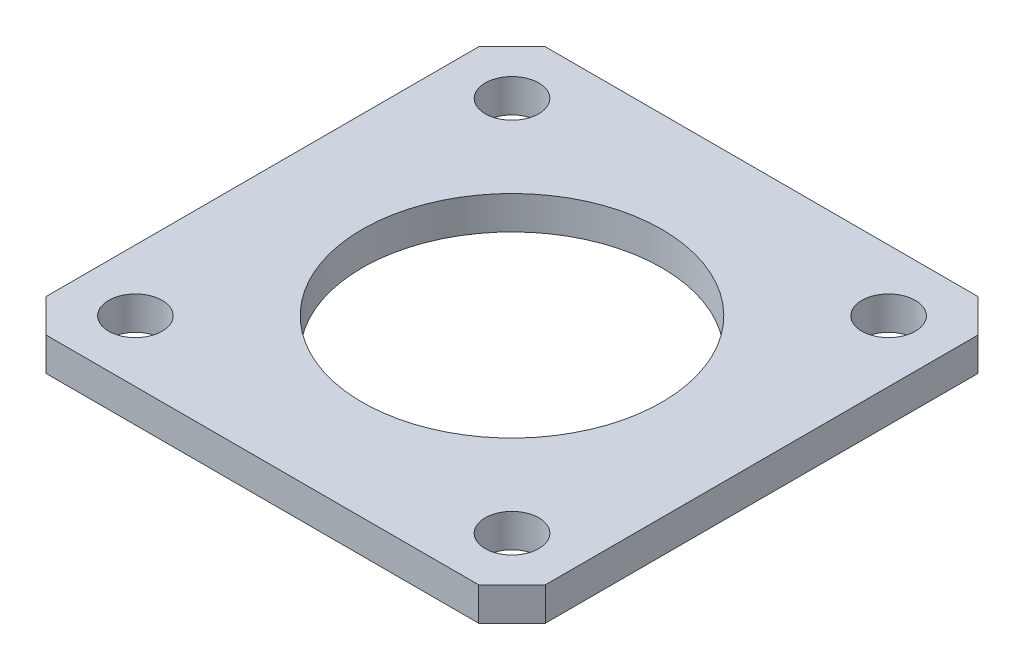
ISO-10303-21;
HEADER;
FILE_DESCRIPTION(('STEP AP214'),'2;1');
FILE_NAME('part.step','',(''),(''),'','','');
FILE_SCHEMA(('AUTOMOTIVE_DESIGN { 1 0 10303 214 1 1 1 1 }'));
ENDSEC;
DATA;
#1=APPLICATION_CONTEXT('core data for automotive mechanical design processes');
#2=APPLICATION_PROTOCOL_DEFINITION('international standard','automotive_design',2000,#1);
#3=PRODUCT_CONTEXT('',#1,'mechanical');
#4=PRODUCT('Part','Part','',(#3));
#5=PRODUCT_RELATED_PRODUCT_CATEGORY('part','',(#4));
#6=PRODUCT_DEFINITION_FORMATION('','',#4);
#7=PRODUCT_DEFINITION_CONTEXT('part definition',#1,'design');
#8=PRODUCT_DEFINITION('design','',#6,#7);
#9=PRODUCT_DEFINITION_SHAPE('','',#8);
#10=(LENGTH_UNIT() NAMED_UNIT(*) SI_UNIT(.MILLI.,.METRE.));
#11=(NAMED_UNIT(*) PLANE_ANGLE_UNIT() SI_UNIT($,.RADIAN.));
#12=(NAMED_UNIT(*) SI_UNIT($,.STERADIAN.) SOLID_ANGLE_UNIT());
#13=UNCERTAINTY_MEASURE_WITH_UNIT(LENGTH_MEASURE(1.E-05),#10,'distance_accuracy_value','');
#14=(GEOMETRIC_REPRESENTATION_CONTEXT(3) GLOBAL_UNCERTAINTY_ASSIGNED_CONTEXT((#13)) GLOBAL_UNIT_ASSIGNED_CONTEXT((#10,
#11,#12)) REPRESENTATION_CONTEXT('',''));
#15=CARTESIAN_POINT('',(0.,0.,0.));
#16=DIRECTION('',(0.,0.,1.));
#17=DIRECTION('',(1.,0.,0.));
#18=AXIS2_PLACEMENT_3D('',#15,#16,#17);
#19=CARTESIAN_POINT('',(0.,3.175,0.));
#20=DIRECTION('',(0.,-1.,0.));
#21=DIRECTION('',(0.,0.,-1.));
#22=AXIS2_PLACEMENT_3D('',#19,#20,#21);
#23=PLANE('',#22);
#24=CARTESIAN_POINT('',(5.85198775786169,3.175,-5.85198775786169));
#25=DIRECTION('',(0.,-1.,0.));
#26=DIRECTION('',(0.,0.,-1.));
#27=AXIS2_PLACEMENT_3D('',#24,#25,#26);
#28=CIRCLE('',#27,2.5527);
#29=CARTESIAN_POINT('',(5.85198775786169,3.175,-8.4046877578617));
#30=VERTEX_POINT('',#29);
#31=EDGE_CURVE('E126',#30,#30,#28,.T.);
#32=ORIENTED_EDGE('',*,*,#31,.T.);
#33=EDGE_LOOP('',(#32));
#34=FACE_BOUND('',#33,.T.);
#35=CARTESIAN_POINT('',(41.7730122421383,3.175,-5.85198775786169));
#36=DIRECTION('',(0.,-1.,0.));
#37=DIRECTION('',(0.,0.,-1.));
#38=AXIS2_PLACEMENT_3D('',#35,#36,#37);
#39=CIRCLE('',#38,2.5527);
#40=CARTESIAN_POINT('',(41.7730122421383,3.175,-8.40468775786169));
#41=VERTEX_POINT('',#40);
#42=EDGE_CURVE('E146',#41,#41,#39,.T.);
#43=ORIENTED_EDGE('',*,*,#42,.T.);
#44=EDGE_LOOP('',(#43));
#45=FACE_BOUND('',#44,.T.);
#46=CARTESIAN_POINT('',(41.7730122421383,3.175,-41.7730122421383));
#47=DIRECTION('',(0.,-1.,0.));
#48=DIRECTION('',(0.,0.,-1.));
#49=AXIS2_PLACEMENT_3D('',#46,#47,#48);
#50=CIRCLE('',#49,2.5527);
#51=CARTESIAN_POINT('',(41.7730122421383,3.175,-44.3257122421383));
#52=VERTEX_POINT('',#51);
#53=EDGE_CURVE('E131',#52,#52,#50,.T.);
#54=ORIENTED_EDGE('',*,*,#53,.T.);
#55=EDGE_LOOP('',(#54));
#56=FACE_BOUND('',#55,.T.);
#57=CARTESIAN_POINT('',(5.85198775786169,3.175,-41.7730122421383));
#58=DIRECTION('',(0.,-1.,0.));
#59=DIRECTION('',(0.,0.,-1.));
#60=AXIS2_PLACEMENT_3D('',#57,#58,#59);
#61=CIRCLE('',#60,2.55270000000001);
#62=CARTESIAN_POINT('',(5.85198775786169,3.175,-44.3257122421383));
#63=VERTEX_POINT('',#62);
#64=EDGE_CURVE('E92',#63,#63,#61,.T.);
#65=ORIENTED_EDGE('',*,*,#64,.T.);
#66=EDGE_LOOP('',(#65));
#67=FACE_BOUND('',#66,.T.);
#68=CARTESIAN_POINT('',(23.8125,3.175,-23.8125));
#69=DIRECTION('',(0.,-1.,0.));
#70=DIRECTION('',(0.,0.,-1.));
#71=AXIS2_PLACEMENT_3D('',#68,#69,#70);
#72=CIRCLE('',#71,14.2875);
#73=CARTESIAN_POINT('',(23.8125,3.175,-38.1));
#74=VERTEX_POINT('',#73);
#75=EDGE_CURVE('E136',#74,#74,#72,.T.);
#76=ORIENTED_EDGE('',*,*,#75,.T.);
#77=EDGE_LOOP('',(#76));
#78=FACE_BOUND('',#77,.T.);
#79=DIRECTION('',(-0.707106781186547,0.,-0.707106781186548));
#80=VECTOR('',#79,1.);
#81=CARTESIAN_POINT('',(3.175,3.175,0.));
#82=LINE('',#81,#80);
#83=CARTESIAN_POINT('',(0.,3.175,-3.17500000000001));
#84=VERTEX_POINT('',#83);
#85=CARTESIAN_POINT('',(3.175,3.175,0.));
#86=VERTEX_POINT('',#85);
#87=EDGE_CURVE('E94',#84,#86,#82,.F.);
#88=ORIENTED_EDGE('',*,*,#87,.T.);
#89=DIRECTION('',(-1.,0.,0.));
#90=VECTOR('',#89,1.);
#91=CARTESIAN_POINT('',(0.,3.175,0.));
#92=LINE('',#91,#90);
#93=CARTESIAN_POINT('',(44.45,3.175,0.));
#94=VERTEX_POINT('',#93);
#95=EDGE_CURVE('E83',#86,#94,#92,.F.);
#96=ORIENTED_EDGE('',*,*,#95,.T.);
#97=DIRECTION('',(-0.707106781186548,0.,0.707106781186547));
#98=VECTOR('',#97,1.);
#99=CARTESIAN_POINT('',(47.625,3.175,-3.175));
#100=LINE('',#99,#98);
#101=CARTESIAN_POINT('',(47.625,3.175,-3.175));
#102=VERTEX_POINT('',#101);
#103=EDGE_CURVE('E141',#94,#102,#100,.F.);
#104=ORIENTED_EDGE('',*,*,#103,.T.);
#105=DIRECTION('',(0.,0.,1.));
#106=VECTOR('',#105,1.);
#107=CARTESIAN_POINT('',(47.625,3.175,0.));
#108=LINE('',#107,#106);
#109=CARTESIAN_POINT('',(47.625,3.175,-44.45));
#110=VERTEX_POINT('',#109);
#111=EDGE_CURVE('E329',#102,#110,#108,.F.);
#112=ORIENTED_EDGE('',*,*,#111,.T.);
#113=DIRECTION('',(0.707106781186546,0.,0.707106781186549));
#114=VECTOR('',#113,1.);
#115=CARTESIAN_POINT('',(44.45,3.175,-47.625));
#116=LINE('',#115,#114);
#117=CARTESIAN_POINT('',(44.45,3.175,-47.625));
#118=VERTEX_POINT('',#117);
#119=EDGE_CURVE('E326',#110,#118,#116,.F.);
#120=ORIENTED_EDGE('',*,*,#119,.T.);
#121=DIRECTION('',(1.,0.,0.));
#122=VECTOR('',#121,1.);
#123=CARTESIAN_POINT('',(0.,3.175,-47.625));
#124=LINE('',#123,#122);
#125=CARTESIAN_POINT('',(3.175,3.175,-47.625));
#126=VERTEX_POINT('',#125);
#127=EDGE_CURVE('E320',#118,#126,#124,.F.);
#128=ORIENTED_EDGE('',*,*,#127,.T.);
#129=DIRECTION('',(0.707106781186549,0.,-0.707106781186546));
#130=VECTOR('',#129,1.);
#131=CARTESIAN_POINT('',(0.,3.175,-44.45));
#132=LINE('',#131,#130);
#133=CARTESIAN_POINT('',(0.,3.175,-44.45));
#134=VERTEX_POINT('',#133);
#135=EDGE_CURVE('E316',#126,#134,#132,.F.);
#136=ORIENTED_EDGE('',*,*,#135,.T.);
#137=DIRECTION('',(0.,0.,-1.));
#138=VECTOR('',#137,1.);
#139=CARTESIAN_POINT('',(0.,3.175,0.));
#140=LINE('',#139,#138);
#141=EDGE_CURVE('E78',#134,#84,#140,.F.);
#142=ORIENTED_EDGE('',*,*,#141,.T.);
#143=EDGE_LOOP('',(#88,#96,#104,#112,#120,#128,#136,#142));
#144=FACE_BOUND('',#143,.T.);
#145=ADVANCED_FACE('F16',(#34,#45,#56,#67,#78,#144),#23,.F.);
#146=CARTESIAN_POINT('',(41.7730122421383,3.175,-5.85198775786169));
#147=DIRECTION('',(0.,-1.,0.));
#148=DIRECTION('',(0.,0.,-1.));
#149=AXIS2_PLACEMENT_3D('',#146,#147,#148);
#150=CYLINDRICAL_SURFACE('',#149,2.5527);
#151=CARTESIAN_POINT('',(41.7730122421383,0.,-5.85198775786169));
#152=DIRECTION('',(0.,-1.,0.));
#153=DIRECTION('',(0.,0.,-1.));
#154=AXIS2_PLACEMENT_3D('',#151,#152,#153);
#155=CIRCLE('',#154,2.5527);
#156=CARTESIAN_POINT('',(41.7730122421383,0.,-8.40468775786169));
#157=VERTEX_POINT('',#156);
#158=EDGE_CURVE('E121',#157,#157,#155,.F.);
#159=ORIENTED_EDGE('',*,*,#158,.F.);
#160=EDGE_LOOP('',(#159));
#161=FACE_BOUND('',#160,.T.);
#162=ORIENTED_EDGE('',*,*,#42,.F.);
#163=EDGE_LOOP('',(#162));
#164=FACE_BOUND('',#163,.T.);
#165=ADVANCED_FACE('F153',(#161,#164),#150,.F.);
#166=CARTESIAN_POINT('',(5.85198775786169,3.175,-41.7730122421383));
#167=DIRECTION('',(0.,-1.,0.));
#168=DIRECTION('',(0.,0.,-1.));
#169=AXIS2_PLACEMENT_3D('',#166,#167,#168);
#170=CYLINDRICAL_SURFACE('',#169,2.55270000000001);
#171=CARTESIAN_POINT('',(5.85198775786169,0.,-41.7730122421383));
#172=DIRECTION('',(0.,-1.,0.));
#173=DIRECTION('',(0.,0.,-1.));
#174=AXIS2_PLACEMENT_3D('',#171,#172,#173);
#175=CIRCLE('',#174,2.55270000000001);
#176=CARTESIAN_POINT('',(5.85198775786169,0.,-44.3257122421383));
#177=VERTEX_POINT('',#176);
#178=EDGE_CURVE('E117',#177,#177,#175,.F.);
#179=ORIENTED_EDGE('',*,*,#178,.F.);
#180=EDGE_LOOP('',(#179));
#181=FACE_BOUND('',#180,.T.);
#182=ORIENTED_EDGE('',*,*,#64,.F.);
#183=EDGE_LOOP('',(#182));
#184=FACE_BOUND('',#183,.T.);
#185=ADVANCED_FACE('F155',(#181,#184),#170,.F.);
#186=CARTESIAN_POINT('',(0.,3.175,0.));
#187=DIRECTION('',(0.,0.,-1.));
#188=DIRECTION('',(-1.,0.,0.));
#189=AXIS2_PLACEMENT_3D('',#186,#187,#188);
#190=PLANE('',#189);
#191=DIRECTION('',(0.,1.,0.));
#192=VECTOR('',#191,1.);
#193=CARTESIAN_POINT('',(3.175,3.175,0.));
#194=LINE('',#193,#192);
#195=CARTESIAN_POINT('',(3.175,0.,0.));
#196=VERTEX_POINT('',#195);
#197=EDGE_CURVE('E86',#86,#196,#194,.F.);
#198=ORIENTED_EDGE('',*,*,#197,.T.);
#199=DIRECTION('',(1.,0.,0.));
#200=VECTOR('',#199,1.);
#201=CARTESIAN_POINT('',(0.,0.,0.));
#202=LINE('',#201,#200);
#203=CARTESIAN_POINT('',(44.45,0.,0.));
#204=VERTEX_POINT('',#203);
#205=EDGE_CURVE('E120',#204,#196,#202,.F.);
#206=ORIENTED_EDGE('',*,*,#205,.F.);
#207=DIRECTION('',(0.,1.,0.));
#208=VECTOR('',#207,1.);
#209=CARTESIAN_POINT('',(44.45,3.175,0.));
#210=LINE('',#209,#208);
#211=EDGE_CURVE('E89',#204,#94,#210,.T.);
#212=ORIENTED_EDGE('',*,*,#211,.T.);
#213=ORIENTED_EDGE('',*,*,#95,.F.);
#214=EDGE_LOOP('',(#198,#206,#212,#213));
#215=FACE_BOUND('',#214,.T.);
#216=ADVANCED_FACE('F84',(#215),#190,.F.);
#217=CARTESIAN_POINT('',(3.175,3.175,0.));
#218=DIRECTION('',(0.707106781186548,0.,-0.707106781186547));
#219=DIRECTION('',(-0.707106781186547,0.,-0.707106781186548));
#220=AXIS2_PLACEMENT_3D('',#217,#218,#219);
#221=PLANE('',#220);
#222=DIRECTION('',(0.,1.,0.));
#223=VECTOR('',#222,1.);
#224=CARTESIAN_POINT('',(0.,3.175,-3.17500000000001));
#225=LINE('',#224,#223);
#226=CARTESIAN_POINT('',(0.,0.,-3.17500000000001));
#227=VERTEX_POINT('',#226);
#228=EDGE_CURVE('E311',#84,#227,#225,.F.);
#229=ORIENTED_EDGE('',*,*,#228,.T.);
#230=DIRECTION('',(-0.707106781186547,0.,-0.707106781186548));
#231=VECTOR('',#230,1.);
#232=CARTESIAN_POINT('',(3.175,0.,0.));
#233=LINE('',#232,#231);
#234=EDGE_CURVE('E100',#196,#227,#233,.T.);
#235=ORIENTED_EDGE('',*,*,#234,.F.);
#236=ORIENTED_EDGE('',*,*,#197,.F.);
#237=ORIENTED_EDGE('',*,*,#87,.F.);
#238=EDGE_LOOP('',(#229,#235,#236,#237));
#239=FACE_BOUND('',#238,.T.);
#240=ADVANCED_FACE('F98',(#239),#221,.F.);
#241=CARTESIAN_POINT('',(0.,3.175,0.));
#242=DIRECTION('',(1.,0.,0.));
#243=DIRECTION('',(0.,0.,-1.));
#244=AXIS2_PLACEMENT_3D('',#241,#242,#243);
#245=PLANE('',#244);
#246=ORIENTED_EDGE('',*,*,#228,.F.);
#247=ORIENTED_EDGE('',*,*,#141,.F.);
#248=DIRECTION('',(0.,1.,0.));
#249=VECTOR('',#248,1.);
#250=CARTESIAN_POINT('',(0.,3.175,-44.45));
#251=LINE('',#250,#249);
#252=CARTESIAN_POINT('',(0.,0.,-44.45));
#253=VERTEX_POINT('',#252);
#254=EDGE_CURVE('E314',#134,#253,#251,.F.);
#255=ORIENTED_EDGE('',*,*,#254,.T.);
#256=DIRECTION('',(0.,0.,-1.));
#257=VECTOR('',#256,1.);
#258=CARTESIAN_POINT('',(0.,0.,0.));
#259=LINE('',#258,#257);
#260=EDGE_CURVE('E313',#227,#253,#259,.T.);
#261=ORIENTED_EDGE('',*,*,#260,.F.);
#262=EDGE_LOOP('',(#246,#247,#255,#261));
#263=FACE_BOUND('',#262,.T.);
#264=ADVANCED_FACE('F205',(#263),#245,.F.);
#265=CARTESIAN_POINT('',(0.,3.175,-44.45));
#266=DIRECTION('',(0.707106781186546,0.,0.707106781186549));
#267=DIRECTION('',(0.707106781186549,0.,-0.707106781186546));
#268=AXIS2_PLACEMENT_3D('',#265,#266,#267);
#269=PLANE('',#268);
#270=DIRECTION('',(0.,1.,0.));
#271=VECTOR('',#270,1.);
#272=CARTESIAN_POINT('',(3.175,3.175,-47.625));
#273=LINE('',#272,#271);
#274=CARTESIAN_POINT('',(3.175,0.,-47.625));
#275=VERTEX_POINT('',#274);
#276=EDGE_CURVE('E322',#126,#275,#273,.F.);
#277=ORIENTED_EDGE('',*,*,#276,.T.);
#278=DIRECTION('',(0.707106781186549,0.,-0.707106781186546));
#279=VECTOR('',#278,1.);
#280=CARTESIAN_POINT('',(0.,0.,-44.45));
#281=LINE('',#280,#279);
#282=EDGE_CURVE('E339',#253,#275,#281,.T.);
#283=ORIENTED_EDGE('',*,*,#282,.F.);
#284=ORIENTED_EDGE('',*,*,#254,.F.);
#285=ORIENTED_EDGE('',*,*,#135,.F.);
#286=EDGE_LOOP('',(#277,#283,#284,#285));
#287=FACE_BOUND('',#286,.T.);
#288=ADVANCED_FACE('F201',(#287),#269,.F.);
#289=CARTESIAN_POINT('',(0.,3.175,-47.625));
#290=DIRECTION('',(0.,0.,1.));
#291=DIRECTION('',(1.,0.,0.));
#292=AXIS2_PLACEMENT_3D('',#289,#290,#291);
#293=PLANE('',#292);
#294=ORIENTED_EDGE('',*,*,#276,.F.);
#295=ORIENTED_EDGE('',*,*,#127,.F.);
#296=DIRECTION('',(0.,1.,0.));
#297=VECTOR('',#296,1.);
#298=CARTESIAN_POINT('',(44.45,3.175,-47.625));
#299=LINE('',#298,#297);
#300=CARTESIAN_POINT('',(44.45,0.,-47.625));
#301=VERTEX_POINT('',#300);
#302=EDGE_CURVE('E324',#118,#301,#299,.F.);
#303=ORIENTED_EDGE('',*,*,#302,.T.);
#304=DIRECTION('',(1.,0.,0.));
#305=VECTOR('',#304,1.);
#306=CARTESIAN_POINT('',(0.,0.,-47.625));
#307=LINE('',#306,#305);
#308=EDGE_CURVE('E342',#275,#301,#307,.T.);
#309=ORIENTED_EDGE('',*,*,#308,.F.);
#310=EDGE_LOOP('',(#294,#295,#303,#309));
#311=FACE_BOUND('',#310,.T.);
#312=ADVANCED_FACE('F197',(#311),#293,.F.);
#313=CARTESIAN_POINT('',(44.45,3.175,-47.625));
#314=DIRECTION('',(-0.707106781186549,0.,0.707106781186546));
#315=DIRECTION('',(0.707106781186546,0.,0.707106781186549));
#316=AXIS2_PLACEMENT_3D('',#313,#314,#315);
#317=PLANE('',#316);
#318=DIRECTION('',(0.,1.,0.));
#319=VECTOR('',#318,1.);
#320=CARTESIAN_POINT('',(47.625,3.175,-44.45));
#321=LINE('',#320,#319);
#322=CARTESIAN_POINT('',(47.625,0.,-44.45));
#323=VERTEX_POINT('',#322);
#324=EDGE_CURVE('E331',#110,#323,#321,.F.);
#325=ORIENTED_EDGE('',*,*,#324,.T.);
#326=DIRECTION('',(0.707106781186546,0.,0.707106781186549));
#327=VECTOR('',#326,1.);
#328=CARTESIAN_POINT('',(44.45,0.,-47.625));
#329=LINE('',#328,#327);
#330=EDGE_CURVE('E345',#301,#323,#329,.T.);
#331=ORIENTED_EDGE('',*,*,#330,.F.);
#332=ORIENTED_EDGE('',*,*,#302,.F.);
#333=ORIENTED_EDGE('',*,*,#119,.F.);
#334=EDGE_LOOP('',(#325,#331,#332,#333));
#335=FACE_BOUND('',#334,.T.);
#336=ADVANCED_FACE('F194',(#335),#317,.F.);
#337=CARTESIAN_POINT('',(47.625,3.175,0.));
#338=DIRECTION('',(-1.,0.,0.));
#339=DIRECTION('',(0.,0.,1.));
#340=AXIS2_PLACEMENT_3D('',#337,#338,#339);
#341=PLANE('',#340);
#342=ORIENTED_EDGE('',*,*,#324,.F.);
#343=ORIENTED_EDGE('',*,*,#111,.F.);
#344=DIRECTION('',(0.,1.,0.));
#345=VECTOR('',#344,1.);
#346=CARTESIAN_POINT('',(47.625,3.175,-3.175));
#347=LINE('',#346,#345);
#348=CARTESIAN_POINT('',(47.625,0.,-3.175));
#349=VERTEX_POINT('',#348);
#350=EDGE_CURVE('E34',#102,#349,#347,.F.);
#351=ORIENTED_EDGE('',*,*,#350,.T.);
#352=DIRECTION('',(0.,0.,-1.));
#353=VECTOR('',#352,1.);
#354=CARTESIAN_POINT('',(47.625,0.,0.));
#355=LINE('',#354,#353);
#356=EDGE_CURVE('E348',#323,#349,#355,.F.);
#357=ORIENTED_EDGE('',*,*,#356,.F.);
#358=EDGE_LOOP('',(#342,#343,#351,#357));
#359=FACE_BOUND('',#358,.T.);
#360=ADVANCED_FACE('F190',(#359),#341,.F.);
#361=CARTESIAN_POINT('',(47.625,3.175,-3.175));
#362=DIRECTION('',(-0.707106781186547,0.,-0.707106781186548));
#363=DIRECTION('',(-0.707106781186548,0.,0.707106781186547));
#364=AXIS2_PLACEMENT_3D('',#361,#362,#363);
#365=PLANE('',#364);
#366=ORIENTED_EDGE('',*,*,#211,.F.);
#367=DIRECTION('',(-0.707106781186548,0.,0.707106781186547));
#368=VECTOR('',#367,1.);
#369=CARTESIAN_POINT('',(47.625,0.,-3.175));
#370=LINE('',#369,#368);
#371=EDGE_CURVE('E114',#349,#204,#370,.T.);
#372=ORIENTED_EDGE('',*,*,#371,.F.);
#373=ORIENTED_EDGE('',*,*,#350,.F.);
#374=ORIENTED_EDGE('',*,*,#103,.F.);
#375=EDGE_LOOP('',(#366,#372,#373,#374));
#376=FACE_BOUND('',#375,.T.);
#377=ADVANCED_FACE('F186',(#376),#365,.F.);
#378=CARTESIAN_POINT('',(23.8125,3.175,-23.8125));
#379=DIRECTION('',(0.,-1.,0.));
#380=DIRECTION('',(0.,0.,-1.));
#381=AXIS2_PLACEMENT_3D('',#378,#379,#380);
#382=CYLINDRICAL_SURFACE('',#381,14.2875);
#383=CARTESIAN_POINT('',(23.8125,0.,-23.8125));
#384=DIRECTION('',(0.,-1.,0.));
#385=DIRECTION('',(0.,0.,-1.));
#386=AXIS2_PLACEMENT_3D('',#383,#384,#385);
#387=CIRCLE('',#386,14.2875);
#388=CARTESIAN_POINT('',(23.8125,0.,-38.1));
#389=VERTEX_POINT('',#388);
#390=EDGE_CURVE('E109',#389,#389,#387,.F.);
#391=ORIENTED_EDGE('',*,*,#390,.F.);
#392=EDGE_LOOP('',(#391));
#393=FACE_BOUND('',#392,.T.);
#394=ORIENTED_EDGE('',*,*,#75,.F.);
#395=EDGE_LOOP('',(#394));
#396=FACE_BOUND('',#395,.T.);
#397=ADVANCED_FACE('F182',(#393,#396),#382,.F.);
#398=CARTESIAN_POINT('',(41.7730122421383,3.175,-41.7730122421383));
#399=DIRECTION('',(0.,-1.,0.));
#400=DIRECTION('',(0.,0.,-1.));
#401=AXIS2_PLACEMENT_3D('',#398,#399,#400);
#402=CYLINDRICAL_SURFACE('',#401,2.5527);
#403=CARTESIAN_POINT('',(41.7730122421383,0.,-41.7730122421383));
#404=DIRECTION('',(0.,-1.,0.));
#405=DIRECTION('',(0.,0.,-1.));
#406=AXIS2_PLACEMENT_3D('',#403,#404,#405);
#407=CIRCLE('',#406,2.5527);
#408=CARTESIAN_POINT('',(41.7730122421383,0.,-44.3257122421383));
#409=VERTEX_POINT('',#408);
#410=EDGE_CURVE('E25',#409,#409,#407,.F.);
#411=ORIENTED_EDGE('',*,*,#410,.F.);
#412=EDGE_LOOP('',(#411));
#413=FACE_BOUND('',#412,.T.);
#414=ORIENTED_EDGE('',*,*,#53,.F.);
#415=EDGE_LOOP('',(#414));
#416=FACE_BOUND('',#415,.T.);
#417=ADVANCED_FACE('F175',(#413,#416),#402,.F.);
#418=CARTESIAN_POINT('',(5.85198775786169,3.175,-5.85198775786169));
#419=DIRECTION('',(0.,-1.,0.));
#420=DIRECTION('',(0.,0.,-1.));
#421=AXIS2_PLACEMENT_3D('',#418,#419,#420);
#422=CYLINDRICAL_SURFACE('',#421,2.5527);
#423=CARTESIAN_POINT('',(5.85198775786169,0.,-5.85198775786169));
#424=DIRECTION('',(0.,-1.,0.));
#425=DIRECTION('',(0.,0.,-1.));
#426=AXIS2_PLACEMENT_3D('',#423,#424,#425);
#427=CIRCLE('',#426,2.5527);
#428=CARTESIAN_POINT('',(5.85198775786169,0.,-8.4046877578617));
#429=VERTEX_POINT('',#428);
#430=EDGE_CURVE('E11',#429,#429,#427,.F.);
#431=ORIENTED_EDGE('',*,*,#430,.F.);
#432=EDGE_LOOP('',(#431));
#433=FACE_BOUND('',#432,.T.);
#434=ORIENTED_EDGE('',*,*,#31,.F.);
#435=EDGE_LOOP('',(#434));
#436=FACE_BOUND('',#435,.T.);
#437=ADVANCED_FACE('F169',(#433,#436),#422,.F.);
#438=CARTESIAN_POINT('',(0.,0.,0.));
#439=DIRECTION('',(0.,-1.,0.));
#440=DIRECTION('',(0.,0.,-1.));
#441=AXIS2_PLACEMENT_3D('',#438,#439,#440);
#442=PLANE('',#441);
#443=ORIENTED_EDGE('',*,*,#430,.T.);
#444=EDGE_LOOP('',(#443));
#445=FACE_BOUND('',#444,.T.);
#446=ORIENTED_EDGE('',*,*,#410,.T.);
#447=EDGE_LOOP('',(#446));
#448=FACE_BOUND('',#447,.T.);
#449=ORIENTED_EDGE('',*,*,#390,.T.);
#450=EDGE_LOOP('',(#449));
#451=FACE_BOUND('',#450,.T.);
#452=ORIENTED_EDGE('',*,*,#356,.T.);
#453=ORIENTED_EDGE('',*,*,#371,.T.);
#454=ORIENTED_EDGE('',*,*,#205,.T.);
#455=ORIENTED_EDGE('',*,*,#234,.T.);
#456=ORIENTED_EDGE('',*,*,#260,.T.);
#457=ORIENTED_EDGE('',*,*,#282,.T.);
#458=ORIENTED_EDGE('',*,*,#308,.T.);
#459=ORIENTED_EDGE('',*,*,#330,.T.);
#460=EDGE_LOOP('',(#452,#453,#454,#455,#456,#457,#458,#459));
#461=FACE_BOUND('',#460,.T.);
#462=ORIENTED_EDGE('',*,*,#178,.T.);
#463=EDGE_LOOP('',(#462));
#464=FACE_BOUND('',#463,.T.);
#465=ORIENTED_EDGE('',*,*,#158,.T.);
#466=EDGE_LOOP('',(#465));
#467=FACE_BOUND('',#466,.T.);
#468=ADVANCED_FACE('F167',(#445,#448,#451,#461,#464,#467),#442,.T.);
#469=CLOSED_SHELL('',(#145,#165,#185,#216,#240,#264,#288,#312,#336,#360,#377,#397,#417,#437,#468));
#470=MANIFOLD_SOLID_BREP('B1',#469);
#471=ADVANCED_BREP_SHAPE_REPRESENTATION('',(#18,#470),#14);
#472=SHAPE_DEFINITION_REPRESENTATION(#9,#471);
ENDSEC;
END-ISO-10303-21;
